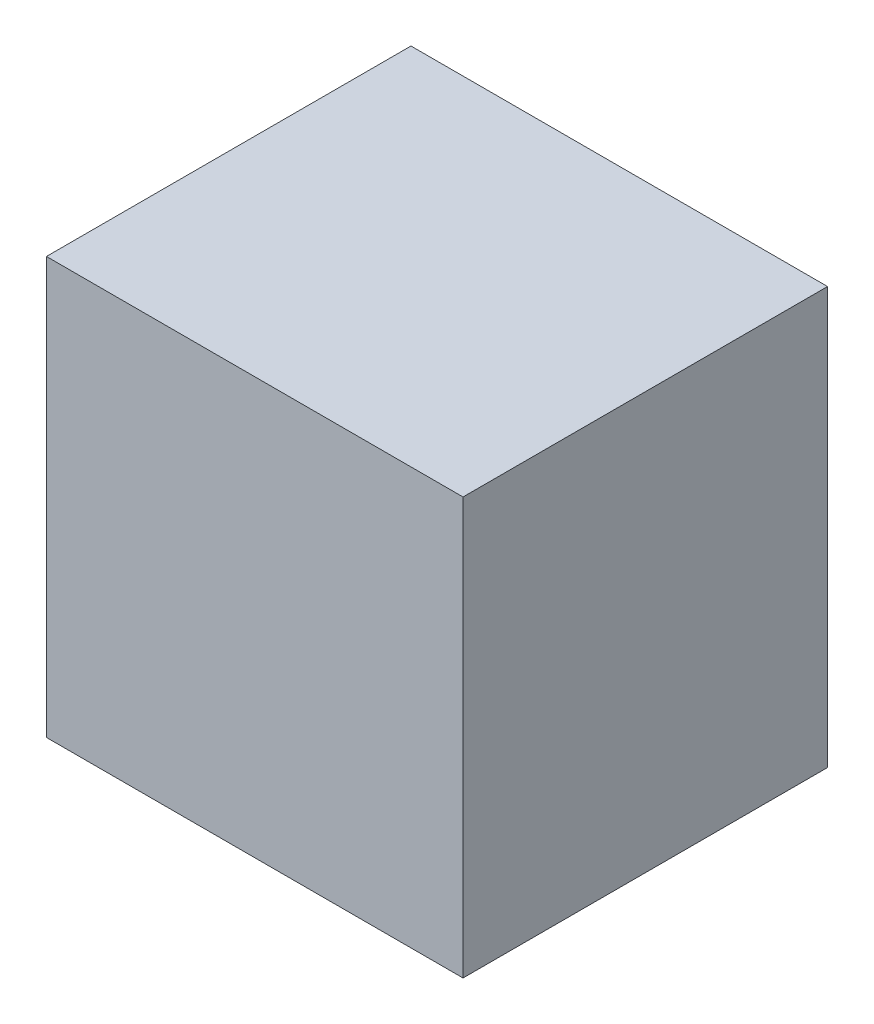
ISO-10303-21;
HEADER;
FILE_DESCRIPTION(('STEP AP214'),'2;1');
FILE_NAME('part.step','',(''),(''),'','','');
FILE_SCHEMA(('AUTOMOTIVE_DESIGN { 1 0 10303 214 1 1 1 1 }'));
ENDSEC;
DATA;
#1=APPLICATION_CONTEXT('core data for automotive mechanical design processes');
#2=APPLICATION_PROTOCOL_DEFINITION('international standard','automotive_design',2000,#1);
#3=PRODUCT_CONTEXT('',#1,'mechanical');
#4=PRODUCT('Part','Part','',(#3));
#5=PRODUCT_RELATED_PRODUCT_CATEGORY('part','',(#4));
#6=PRODUCT_DEFINITION_FORMATION('','',#4);
#7=PRODUCT_DEFINITION_CONTEXT('part definition',#1,'design');
#8=PRODUCT_DEFINITION('design','',#6,#7);
#9=PRODUCT_DEFINITION_SHAPE('','',#8);
#10=(LENGTH_UNIT() NAMED_UNIT(*) SI_UNIT(.MILLI.,.METRE.));
#11=(NAMED_UNIT(*) PLANE_ANGLE_UNIT() SI_UNIT($,.RADIAN.));
#12=(NAMED_UNIT(*) SI_UNIT($,.STERADIAN.) SOLID_ANGLE_UNIT());
#13=UNCERTAINTY_MEASURE_WITH_UNIT(LENGTH_MEASURE(1.E-05),#10,'distance_accuracy_value','');
#14=(GEOMETRIC_REPRESENTATION_CONTEXT(3) GLOBAL_UNCERTAINTY_ASSIGNED_CONTEXT((#13)) GLOBAL_UNIT_ASSIGNED_CONTEXT((#10,
#11,#12)) REPRESENTATION_CONTEXT('',''));
#15=CARTESIAN_POINT('',(0.,0.,0.));
#16=DIRECTION('',(0.,0.,1.));
#17=DIRECTION('',(1.,0.,0.));
#18=AXIS2_PLACEMENT_3D('',#15,#16,#17);
#19=CARTESIAN_POINT('',(125.,-20.,-45.));
#20=DIRECTION('',(0.,1.,0.));
#21=DIRECTION('',(-1.,0.,0.));
#22=AXIS2_PLACEMENT_3D('',#19,#20,#21);
#23=PLANE('',#22);
#24=DIRECTION('',(-1.,0.,0.));
#25=VECTOR('',#24,1.);
#26=CARTESIAN_POINT('',(125.,-20.,-10.));
#27=LINE('',#26,#25);
#28=CARTESIAN_POINT('',(125.,-20.,-10.));
#29=VERTEX_POINT('',#28);
#30=CARTESIAN_POINT('',(85.,-20.,-10.));
#31=VERTEX_POINT('',#30);
#32=EDGE_CURVE('E157',#29,#31,#27,.T.);
#33=ORIENTED_EDGE('',*,*,#32,.T.);
#34=DIRECTION('',(0.,0.,1.));
#35=VECTOR('',#34,1.);
#36=CARTESIAN_POINT('',(85.,-20.,-45.));
#37=LINE('',#36,#35);
#38=CARTESIAN_POINT('',(85.,-20.,-45.));
#39=VERTEX_POINT('',#38);
#40=EDGE_CURVE('E11',#39,#31,#37,.T.);
#41=ORIENTED_EDGE('',*,*,#40,.F.);
#42=DIRECTION('',(-1.,0.,0.));
#43=VECTOR('',#42,1.);
#44=CARTESIAN_POINT('',(125.,-20.,-45.));
#45=LINE('',#44,#43);
#46=CARTESIAN_POINT('',(125.,-20.,-45.));
#47=VERTEX_POINT('',#46);
#48=EDGE_CURVE('E161',#47,#39,#45,.T.);
#49=ORIENTED_EDGE('',*,*,#48,.F.);
#50=DIRECTION('',(0.,0.,1.));
#51=VECTOR('',#50,1.);
#52=CARTESIAN_POINT('',(125.,-20.,-45.));
#53=LINE('',#52,#51);
#54=EDGE_CURVE('E167',#47,#29,#53,.T.);
#55=ORIENTED_EDGE('',*,*,#54,.T.);
#56=EDGE_LOOP('',(#33,#41,#49,#55));
#57=FACE_BOUND('',#56,.T.);
#58=ADVANCED_FACE('F44',(#57),#23,.F.);
#59=CARTESIAN_POINT('',(85.,-20.,-45.));
#60=DIRECTION('',(1.,0.,0.));
#61=DIRECTION('',(0.,0.,-1.));
#62=AXIS2_PLACEMENT_3D('',#59,#60,#61);
#63=PLANE('',#62);
#64=DIRECTION('',(0.,1.,0.));
#65=VECTOR('',#64,1.);
#66=CARTESIAN_POINT('',(85.,-20.,-10.));
#67=LINE('',#66,#65);
#68=CARTESIAN_POINT('',(85.,20.,-10.));
#69=VERTEX_POINT('',#68);
#70=EDGE_CURVE('E170',#31,#69,#67,.T.);
#71=ORIENTED_EDGE('',*,*,#70,.T.);
#72=DIRECTION('',(0.,0.,1.));
#73=VECTOR('',#72,1.);
#74=CARTESIAN_POINT('',(85.,20.,-45.));
#75=LINE('',#74,#73);
#76=CARTESIAN_POINT('',(85.,20.,-45.));
#77=VERTEX_POINT('',#76);
#78=EDGE_CURVE('E52',#77,#69,#75,.T.);
#79=ORIENTED_EDGE('',*,*,#78,.F.);
#80=DIRECTION('',(0.,1.,0.));
#81=VECTOR('',#80,1.);
#82=CARTESIAN_POINT('',(85.,-20.,-45.));
#83=LINE('',#82,#81);
#84=EDGE_CURVE('E91',#39,#77,#83,.T.);
#85=ORIENTED_EDGE('',*,*,#84,.F.);
#86=ORIENTED_EDGE('',*,*,#40,.T.);
#87=EDGE_LOOP('',(#71,#79,#85,#86));
#88=FACE_BOUND('',#87,.T.);
#89=ADVANCED_FACE('F194',(#88),#63,.F.);
#90=CARTESIAN_POINT('',(125.,20.,-45.));
#91=DIRECTION('',(0.,-1.,0.));
#92=DIRECTION('',(0.,0.,-1.));
#93=AXIS2_PLACEMENT_3D('',#90,#91,#92);
#94=PLANE('',#93);
#95=DIRECTION('',(1.,0.,0.));
#96=VECTOR('',#95,1.);
#97=CARTESIAN_POINT('',(125.,20.,-10.));
#98=LINE('',#97,#96);
#99=CARTESIAN_POINT('',(125.,20.,-10.));
#100=VERTEX_POINT('',#99);
#101=EDGE_CURVE('E78',#69,#100,#98,.T.);
#102=ORIENTED_EDGE('',*,*,#101,.T.);
#103=DIRECTION('',(0.,0.,1.));
#104=VECTOR('',#103,1.);
#105=CARTESIAN_POINT('',(125.,20.,-45.));
#106=LINE('',#105,#104);
#107=CARTESIAN_POINT('',(125.,20.,-45.));
#108=VERTEX_POINT('',#107);
#109=EDGE_CURVE('E175',#108,#100,#106,.T.);
#110=ORIENTED_EDGE('',*,*,#109,.F.);
#111=DIRECTION('',(1.,0.,0.));
#112=VECTOR('',#111,1.);
#113=CARTESIAN_POINT('',(125.,20.,-45.));
#114=LINE('',#113,#112);
#115=EDGE_CURVE('E164',#77,#108,#114,.T.);
#116=ORIENTED_EDGE('',*,*,#115,.F.);
#117=ORIENTED_EDGE('',*,*,#78,.T.);
#118=EDGE_LOOP('',(#102,#110,#116,#117));
#119=FACE_BOUND('',#118,.T.);
#120=ADVANCED_FACE('F177',(#119),#94,.F.);
#121=CARTESIAN_POINT('',(125.,-20.,-45.));
#122=DIRECTION('',(-1.,0.,0.));
#123=DIRECTION('',(0.,0.,1.));
#124=AXIS2_PLACEMENT_3D('',#121,#122,#123);
#125=PLANE('',#124);
#126=DIRECTION('',(0.,-1.,0.));
#127=VECTOR('',#126,1.);
#128=CARTESIAN_POINT('',(125.,-20.,-10.));
#129=LINE('',#128,#127);
#130=EDGE_CURVE('E84',#100,#29,#129,.T.);
#131=ORIENTED_EDGE('',*,*,#130,.T.);
#132=ORIENTED_EDGE('',*,*,#54,.F.);
#133=DIRECTION('',(0.,-1.,0.));
#134=VECTOR('',#133,1.);
#135=CARTESIAN_POINT('',(125.,-20.,-45.));
#136=LINE('',#135,#134);
#137=EDGE_CURVE('E60',#108,#47,#136,.T.);
#138=ORIENTED_EDGE('',*,*,#137,.F.);
#139=ORIENTED_EDGE('',*,*,#109,.T.);
#140=EDGE_LOOP('',(#131,#132,#138,#139));
#141=FACE_BOUND('',#140,.T.);
#142=ADVANCED_FACE('F184',(#141),#125,.F.);
#143=CARTESIAN_POINT('',(0.,0.,-45.));
#144=DIRECTION('',(0.,0.,-1.));
#145=DIRECTION('',(-1.,0.,0.));
#146=AXIS2_PLACEMENT_3D('',#143,#144,#145);
#147=PLANE('',#146);
#148=ORIENTED_EDGE('',*,*,#48,.T.);
#149=ORIENTED_EDGE('',*,*,#84,.T.);
#150=ORIENTED_EDGE('',*,*,#115,.T.);
#151=ORIENTED_EDGE('',*,*,#137,.T.);
#152=EDGE_LOOP('',(#148,#149,#150,#151));
#153=FACE_BOUND('',#152,.T.);
#154=ADVANCED_FACE('F186',(#153),#147,.T.);
#155=CARTESIAN_POINT('',(0.,0.,-10.));
#156=DIRECTION('',(0.,0.,-1.));
#157=DIRECTION('',(-1.,0.,0.));
#158=AXIS2_PLACEMENT_3D('',#155,#156,#157);
#159=PLANE('',#158);
#160=ORIENTED_EDGE('',*,*,#32,.F.);
#161=ORIENTED_EDGE('',*,*,#130,.F.);
#162=ORIENTED_EDGE('',*,*,#101,.F.);
#163=ORIENTED_EDGE('',*,*,#70,.F.);
#164=EDGE_LOOP('',(#160,#161,#162,#163));
#165=FACE_BOUND('',#164,.T.);
#166=ADVANCED_FACE('F180',(#165),#159,.F.);
#167=CLOSED_SHELL('',(#58,#89,#120,#142,#154,#166));
#168=CARTESIAN_POINT('',(122.,-17.,-13.));
#169=DIRECTION('',(1.,0.,0.));
#170=DIRECTION('',(0.,0.,-1.));
#171=AXIS2_PLACEMENT_3D('',#168,#169,#170);
#172=PLANE('',#171);
#173=DIRECTION('',(0.,-1.,0.));
#174=VECTOR('',#173,1.);
#175=CARTESIAN_POINT('',(122.,-17.,-42.));
#176=LINE('',#175,#174);
#177=CARTESIAN_POINT('',(122.,17.,-42.));
#178=VERTEX_POINT('',#177);
#179=CARTESIAN_POINT('',(122.,-17.,-42.));
#180=VERTEX_POINT('',#179);
#181=EDGE_CURVE('E125',#178,#180,#176,.T.);
#182=ORIENTED_EDGE('',*,*,#181,.T.);
#183=DIRECTION('',(0.,0.,-1.));
#184=VECTOR('',#183,1.);
#185=CARTESIAN_POINT('',(122.,-17.,-13.));
#186=LINE('',#185,#184);
#187=CARTESIAN_POINT('',(122.,-17.,-13.));
#188=VERTEX_POINT('',#187);
#189=EDGE_CURVE('E118',#188,#180,#186,.T.);
#190=ORIENTED_EDGE('',*,*,#189,.F.);
#191=DIRECTION('',(0.,-1.,0.));
#192=VECTOR('',#191,1.);
#193=CARTESIAN_POINT('',(122.,-17.,-13.));
#194=LINE('',#193,#192);
#195=CARTESIAN_POINT('',(122.,17.,-13.));
#196=VERTEX_POINT('',#195);
#197=EDGE_CURVE('E122',#196,#188,#194,.T.);
#198=ORIENTED_EDGE('',*,*,#197,.F.);
#199=DIRECTION('',(0.,0.,-1.));
#200=VECTOR('',#199,1.);
#201=CARTESIAN_POINT('',(122.,17.,-13.));
#202=LINE('',#201,#200);
#203=EDGE_CURVE('E155',#196,#178,#202,.T.);
#204=ORIENTED_EDGE('',*,*,#203,.T.);
#205=EDGE_LOOP('',(#182,#190,#198,#204));
#206=FACE_BOUND('',#205,.T.);
#207=ADVANCED_FACE('F120',(#206),#172,.F.);
#208=CARTESIAN_POINT('',(88.,17.,-13.));
#209=DIRECTION('',(0.,1.,0.));
#210=DIRECTION('',(0.,0.,1.));
#211=AXIS2_PLACEMENT_3D('',#208,#209,#210);
#212=PLANE('',#211);
#213=DIRECTION('',(1.,0.,0.));
#214=VECTOR('',#213,1.);
#215=CARTESIAN_POINT('',(88.,17.,-42.));
#216=LINE('',#215,#214);
#217=CARTESIAN_POINT('',(88.,17.,-42.));
#218=VERTEX_POINT('',#217);
#219=EDGE_CURVE('E142',#218,#178,#216,.T.);
#220=ORIENTED_EDGE('',*,*,#219,.T.);
#221=ORIENTED_EDGE('',*,*,#203,.F.);
#222=DIRECTION('',(1.,0.,0.));
#223=VECTOR('',#222,1.);
#224=CARTESIAN_POINT('',(88.,17.,-13.));
#225=LINE('',#224,#223);
#226=CARTESIAN_POINT('',(88.,17.,-13.));
#227=VERTEX_POINT('',#226);
#228=EDGE_CURVE('E130',#227,#196,#225,.T.);
#229=ORIENTED_EDGE('',*,*,#228,.F.);
#230=DIRECTION('',(0.,0.,-1.));
#231=VECTOR('',#230,1.);
#232=CARTESIAN_POINT('',(88.,17.,-13.));
#233=LINE('',#232,#231);
#234=EDGE_CURVE('E158',#227,#218,#233,.T.);
#235=ORIENTED_EDGE('',*,*,#234,.T.);
#236=EDGE_LOOP('',(#220,#221,#229,#235));
#237=FACE_BOUND('',#236,.T.);
#238=ADVANCED_FACE('F235',(#237),#212,.F.);
#239=CARTESIAN_POINT('',(88.,-17.,-13.));
#240=DIRECTION('',(-1.,0.,0.));
#241=DIRECTION('',(0.,0.,1.));
#242=AXIS2_PLACEMENT_3D('',#239,#240,#241);
#243=PLANE('',#242);
#244=DIRECTION('',(0.,1.,0.));
#245=VECTOR('',#244,1.);
#246=CARTESIAN_POINT('',(88.,-17.,-42.));
#247=LINE('',#246,#245);
#248=CARTESIAN_POINT('',(88.,-17.,-42.));
#249=VERTEX_POINT('',#248);
#250=EDGE_CURVE('E145',#249,#218,#247,.T.);
#251=ORIENTED_EDGE('',*,*,#250,.T.);
#252=ORIENTED_EDGE('',*,*,#234,.F.);
#253=DIRECTION('',(0.,1.,0.));
#254=VECTOR('',#253,1.);
#255=CARTESIAN_POINT('',(88.,-17.,-13.));
#256=LINE('',#255,#254);
#257=CARTESIAN_POINT('',(88.,-17.,-13.));
#258=VERTEX_POINT('',#257);
#259=EDGE_CURVE('E138',#258,#227,#256,.T.);
#260=ORIENTED_EDGE('',*,*,#259,.F.);
#261=DIRECTION('',(0.,0.,-1.));
#262=VECTOR('',#261,1.);
#263=CARTESIAN_POINT('',(88.,-17.,-13.));
#264=LINE('',#263,#262);
#265=EDGE_CURVE('E129',#258,#249,#264,.T.);
#266=ORIENTED_EDGE('',*,*,#265,.T.);
#267=EDGE_LOOP('',(#251,#252,#260,#266));
#268=FACE_BOUND('',#267,.T.);
#269=ADVANCED_FACE('F245',(#268),#243,.F.);
#270=CARTESIAN_POINT('',(88.,-17.,-13.));
#271=DIRECTION('',(0.,-1.,0.));
#272=DIRECTION('',(0.,0.,-1.));
#273=AXIS2_PLACEMENT_3D('',#270,#271,#272);
#274=PLANE('',#273);
#275=DIRECTION('',(-1.,0.,0.));
#276=VECTOR('',#275,1.);
#277=CARTESIAN_POINT('',(88.,-17.,-42.));
#278=LINE('',#277,#276);
#279=EDGE_CURVE('E151',#180,#249,#278,.T.);
#280=ORIENTED_EDGE('',*,*,#279,.T.);
#281=ORIENTED_EDGE('',*,*,#265,.F.);
#282=DIRECTION('',(-1.,0.,0.));
#283=VECTOR('',#282,1.);
#284=CARTESIAN_POINT('',(88.,-17.,-13.));
#285=LINE('',#284,#283);
#286=EDGE_CURVE('E133',#188,#258,#285,.T.);
#287=ORIENTED_EDGE('',*,*,#286,.F.);
#288=ORIENTED_EDGE('',*,*,#189,.T.);
#289=EDGE_LOOP('',(#280,#281,#287,#288));
#290=FACE_BOUND('',#289,.T.);
#291=ADVANCED_FACE('F134',(#290),#274,.F.);
#292=CARTESIAN_POINT('',(0.,0.,-13.));
#293=DIRECTION('',(0.,0.,-1.));
#294=DIRECTION('',(-1.,0.,0.));
#295=AXIS2_PLACEMENT_3D('',#292,#293,#294);
#296=PLANE('',#295);
#297=ORIENTED_EDGE('',*,*,#197,.T.);
#298=ORIENTED_EDGE('',*,*,#286,.T.);
#299=ORIENTED_EDGE('',*,*,#259,.T.);
#300=ORIENTED_EDGE('',*,*,#228,.T.);
#301=EDGE_LOOP('',(#297,#298,#299,#300));
#302=FACE_BOUND('',#301,.T.);
#303=ADVANCED_FACE('F140',(#302),#296,.T.);
#304=CARTESIAN_POINT('',(0.,0.,-42.));
#305=DIRECTION('',(0.,0.,-1.));
#306=DIRECTION('',(-1.,0.,0.));
#307=AXIS2_PLACEMENT_3D('',#304,#305,#306);
#308=PLANE('',#307);
#309=ORIENTED_EDGE('',*,*,#181,.F.);
#310=ORIENTED_EDGE('',*,*,#219,.F.);
#311=ORIENTED_EDGE('',*,*,#250,.F.);
#312=ORIENTED_EDGE('',*,*,#279,.F.);
#313=EDGE_LOOP('',(#309,#310,#311,#312));
#314=FACE_BOUND('',#313,.T.);
#315=ADVANCED_FACE('F272',(#314),#308,.F.);
#316=CLOSED_SHELL('',(#207,#238,#269,#291,#303,#315));
#317=ORIENTED_CLOSED_SHELL('',*,#316,.T.);
#318=BREP_WITH_VOIDS('B2',#167,(#317));
#319=ADVANCED_BREP_SHAPE_REPRESENTATION('',(#18,#318),#14);
#320=SHAPE_DEFINITION_REPRESENTATION(#9,#319);
ENDSEC;
END-ISO-10303-21;
